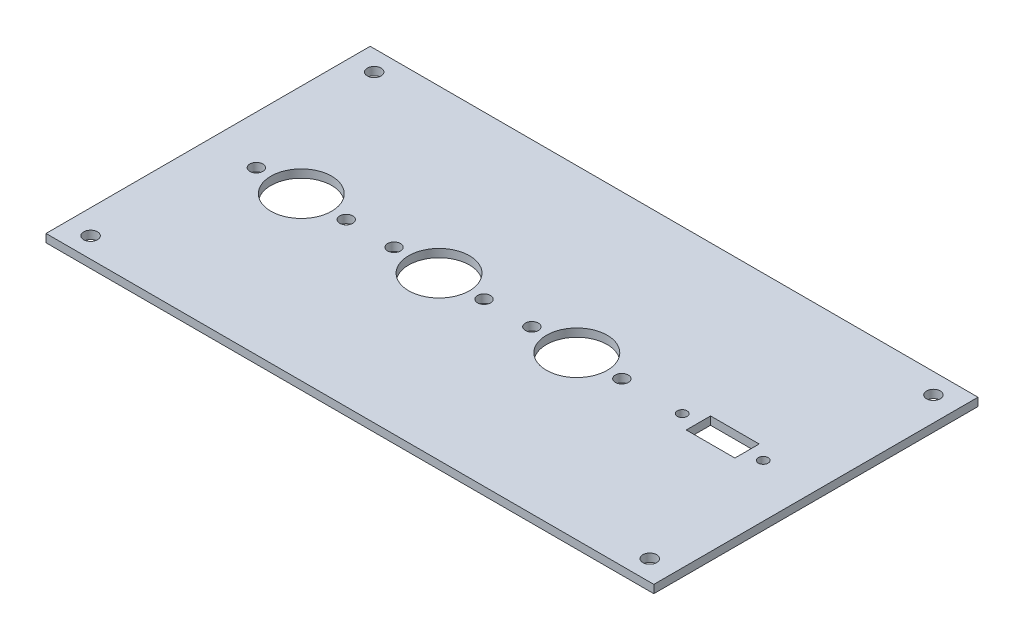
ISO-10303-21;
HEADER;
FILE_DESCRIPTION(('STEP AP214'),'2;1');
FILE_NAME('part.step','',(''),(''),'','','');
FILE_SCHEMA(('AUTOMOTIVE_DESIGN { 1 0 10303 214 1 1 1 1 }'));
ENDSEC;
DATA;
#1=APPLICATION_CONTEXT('core data for automotive mechanical design processes');
#2=APPLICATION_PROTOCOL_DEFINITION('international standard','automotive_design',2000,#1);
#3=PRODUCT_CONTEXT('',#1,'mechanical');
#4=PRODUCT('Part','Part','',(#3));
#5=PRODUCT_RELATED_PRODUCT_CATEGORY('part','',(#4));
#6=PRODUCT_DEFINITION_FORMATION('','',#4);
#7=PRODUCT_DEFINITION_CONTEXT('part definition',#1,'design');
#8=PRODUCT_DEFINITION('design','',#6,#7);
#9=PRODUCT_DEFINITION_SHAPE('','',#8);
#10=(LENGTH_UNIT() NAMED_UNIT(*) SI_UNIT(.MILLI.,.METRE.));
#11=(NAMED_UNIT(*) PLANE_ANGLE_UNIT() SI_UNIT($,.RADIAN.));
#12=(NAMED_UNIT(*) SI_UNIT($,.STERADIAN.) SOLID_ANGLE_UNIT());
#13=UNCERTAINTY_MEASURE_WITH_UNIT(LENGTH_MEASURE(1.E-05),#10,'distance_accuracy_value','');
#14=(GEOMETRIC_REPRESENTATION_CONTEXT(3) GLOBAL_UNCERTAINTY_ASSIGNED_CONTEXT((#13)) GLOBAL_UNIT_ASSIGNED_CONTEXT((#10,
#11,#12)) REPRESENTATION_CONTEXT('',''));
#15=CARTESIAN_POINT('',(0.,0.,0.));
#16=DIRECTION('',(0.,0.,1.));
#17=DIRECTION('',(1.,0.,0.));
#18=AXIS2_PLACEMENT_3D('',#15,#16,#17);
#19=CARTESIAN_POINT('',(0.,0.,80.));
#20=DIRECTION('',(0.,0.,1.));
#21=DIRECTION('',(1.,0.,0.));
#22=AXIS2_PLACEMENT_3D('',#19,#20,#21);
#23=PLANE('',#22);
#24=DIRECTION('',(-1.,0.,0.));
#25=VECTOR('',#24,1.);
#26=CARTESIAN_POINT('',(0.,-1.,80.));
#27=LINE('',#26,#25);
#28=CARTESIAN_POINT('',(75.,-1.,80.));
#29=VERTEX_POINT('',#28);
#30=CARTESIAN_POINT('',(-75.,-1.,80.));
#31=VERTEX_POINT('',#30);
#32=EDGE_CURVE('E87',#29,#31,#27,.T.);
#33=ORIENTED_EDGE('',*,*,#32,.F.);
#34=DIRECTION('',(0.,-1.,0.));
#35=VECTOR('',#34,1.);
#36=CARTESIAN_POINT('',(75.,0.,80.));
#37=LINE('',#36,#35);
#38=CARTESIAN_POINT('',(75.,1.,80.));
#39=VERTEX_POINT('',#38);
#40=EDGE_CURVE('E255',#39,#29,#37,.T.);
#41=ORIENTED_EDGE('',*,*,#40,.F.);
#42=DIRECTION('',(1.,0.,0.));
#43=VECTOR('',#42,1.);
#44=CARTESIAN_POINT('',(0.,1.,80.));
#45=LINE('',#44,#43);
#46=CARTESIAN_POINT('',(-75.,1.,80.));
#47=VERTEX_POINT('',#46);
#48=EDGE_CURVE('E259',#47,#39,#45,.T.);
#49=ORIENTED_EDGE('',*,*,#48,.F.);
#50=DIRECTION('',(0.,1.,0.));
#51=VECTOR('',#50,1.);
#52=CARTESIAN_POINT('',(-75.,0.,80.));
#53=LINE('',#52,#51);
#54=EDGE_CURVE('E262',#31,#47,#53,.T.);
#55=ORIENTED_EDGE('',*,*,#54,.F.);
#56=EDGE_LOOP('',(#33,#41,#49,#55));
#57=FACE_BOUND('',#56,.T.);
#58=ADVANCED_FACE('F17',(#57),#23,.T.);
#59=CARTESIAN_POINT('',(0.,-1.,0.));
#60=DIRECTION('',(0.,-1.,0.));
#61=DIRECTION('',(0.,0.,-1.));
#62=AXIS2_PLACEMENT_3D('',#59,#60,#61);
#63=PLANE('',#62);
#64=CARTESIAN_POINT('',(69.,-1.,75.));
#65=DIRECTION('',(0.,-1.,0.));
#66=DIRECTION('',(0.,0.,-1.));
#67=AXIS2_PLACEMENT_3D('',#64,#65,#66);
#68=CIRCLE('',#67,1.7);
#69=CARTESIAN_POINT('',(69.,-1.,73.3));
#70=VERTEX_POINT('',#69);
#71=EDGE_CURVE('E134',#70,#70,#68,.T.);
#72=ORIENTED_EDGE('',*,*,#71,.F.);
#73=EDGE_LOOP('',(#72));
#74=FACE_BOUND('',#73,.T.);
#75=CARTESIAN_POINT('',(69.,-1.,5.));
#76=DIRECTION('',(0.,-1.,0.));
#77=DIRECTION('',(0.,0.,-1.));
#78=AXIS2_PLACEMENT_3D('',#75,#76,#77);
#79=CIRCLE('',#78,1.7);
#80=CARTESIAN_POINT('',(69.,-1.,3.3));
#81=VERTEX_POINT('',#80);
#82=EDGE_CURVE('E130',#81,#81,#79,.T.);
#83=ORIENTED_EDGE('',*,*,#82,.F.);
#84=EDGE_LOOP('',(#83));
#85=FACE_BOUND('',#84,.T.);
#86=CARTESIAN_POINT('',(-69.,-1.,75.));
#87=DIRECTION('',(0.,-1.,0.));
#88=DIRECTION('',(0.,0.,-1.));
#89=AXIS2_PLACEMENT_3D('',#86,#87,#88);
#90=CIRCLE('',#89,1.7);
#91=CARTESIAN_POINT('',(-69.,-1.,73.3));
#92=VERTEX_POINT('',#91);
#93=EDGE_CURVE('E126',#92,#92,#90,.T.);
#94=ORIENTED_EDGE('',*,*,#93,.F.);
#95=EDGE_LOOP('',(#94));
#96=FACE_BOUND('',#95,.T.);
#97=CARTESIAN_POINT('',(-69.,-1.,5.));
#98=DIRECTION('',(0.,-1.,0.));
#99=DIRECTION('',(0.,0.,-1.));
#100=AXIS2_PLACEMENT_3D('',#97,#98,#99);
#101=CIRCLE('',#100,1.7);
#102=CARTESIAN_POINT('',(-69.,-1.,3.3));
#103=VERTEX_POINT('',#102);
#104=EDGE_CURVE('E121',#103,#103,#101,.T.);
#105=ORIENTED_EDGE('',*,*,#104,.F.);
#106=EDGE_LOOP('',(#105));
#107=FACE_BOUND('',#106,.T.);
#108=CARTESIAN_POINT('',(62.,-1.,40.));
#109=DIRECTION('',(0.,-1.,0.));
#110=DIRECTION('',(0.,0.,-1.));
#111=AXIS2_PLACEMENT_3D('',#108,#109,#110);
#112=CIRCLE('',#111,1.2);
#113=CARTESIAN_POINT('',(62.,-1.,38.8));
#114=VERTEX_POINT('',#113);
#115=EDGE_CURVE('E116',#114,#114,#112,.T.);
#116=ORIENTED_EDGE('',*,*,#115,.F.);
#117=EDGE_LOOP('',(#116));
#118=FACE_BOUND('',#117,.T.);
#119=CARTESIAN_POINT('',(42.,-1.,40.));
#120=DIRECTION('',(0.,-1.,0.));
#121=DIRECTION('',(0.,0.,-1.));
#122=AXIS2_PLACEMENT_3D('',#119,#120,#121);
#123=CIRCLE('',#122,1.2);
#124=CARTESIAN_POINT('',(42.,-1.,38.8));
#125=VERTEX_POINT('',#124);
#126=EDGE_CURVE('E115',#125,#125,#123,.T.);
#127=ORIENTED_EDGE('',*,*,#126,.F.);
#128=EDGE_LOOP('',(#127));
#129=FACE_BOUND('',#128,.T.);
#130=DIRECTION('',(-1.,0.,0.));
#131=VECTOR('',#130,1.);
#132=CARTESIAN_POINT('',(0.,-1.,43.));
#133=LINE('',#132,#131);
#134=CARTESIAN_POINT('',(58.,-1.,43.));
#135=VERTEX_POINT('',#134);
#136=CARTESIAN_POINT('',(46.,-1.,43.));
#137=VERTEX_POINT('',#136);
#138=EDGE_CURVE('E178',#135,#137,#133,.T.);
#139=ORIENTED_EDGE('',*,*,#138,.F.);
#140=DIRECTION('',(0.,0.,1.));
#141=VECTOR('',#140,1.);
#142=CARTESIAN_POINT('',(58.,-1.,0.));
#143=LINE('',#142,#141);
#144=CARTESIAN_POINT('',(58.,-1.,37.));
#145=VERTEX_POINT('',#144);
#146=EDGE_CURVE('E170',#145,#135,#143,.T.);
#147=ORIENTED_EDGE('',*,*,#146,.F.);
#148=DIRECTION('',(1.,0.,0.));
#149=VECTOR('',#148,1.);
#150=CARTESIAN_POINT('',(0.,-1.,37.));
#151=LINE('',#150,#149);
#152=CARTESIAN_POINT('',(46.,-1.,37.));
#153=VERTEX_POINT('',#152);
#154=EDGE_CURVE('E94',#153,#145,#151,.T.);
#155=ORIENTED_EDGE('',*,*,#154,.F.);
#156=DIRECTION('',(0.,0.,-1.));
#157=VECTOR('',#156,1.);
#158=CARTESIAN_POINT('',(46.,-1.,0.));
#159=LINE('',#158,#157);
#160=EDGE_CURVE('E175',#137,#153,#159,.T.);
#161=ORIENTED_EDGE('',*,*,#160,.F.);
#162=EDGE_LOOP('',(#139,#147,#155,#161));
#163=FACE_BOUND('',#162,.T.);
#164=CARTESIAN_POINT('',(27.1,-1.,40.));
#165=DIRECTION('',(0.,-1.,0.));
#166=DIRECTION('',(0.,0.,-1.));
#167=AXIS2_PLACEMENT_3D('',#164,#165,#166);
#168=CIRCLE('',#167,1.6);
#169=CARTESIAN_POINT('',(27.1,-1.,38.4));
#170=VERTEX_POINT('',#169);
#171=EDGE_CURVE('E182',#170,#170,#168,.T.);
#172=ORIENTED_EDGE('',*,*,#171,.F.);
#173=EDGE_LOOP('',(#172));
#174=FACE_BOUND('',#173,.T.);
#175=CARTESIAN_POINT('',(4.9,-1.,40.));
#176=DIRECTION('',(0.,-1.,0.));
#177=DIRECTION('',(0.,0.,-1.));
#178=AXIS2_PLACEMENT_3D('',#175,#176,#177);
#179=CIRCLE('',#178,1.6);
#180=CARTESIAN_POINT('',(4.9,-1.,38.4));
#181=VERTEX_POINT('',#180);
#182=EDGE_CURVE('E186',#181,#181,#179,.T.);
#183=ORIENTED_EDGE('',*,*,#182,.F.);
#184=EDGE_LOOP('',(#183));
#185=FACE_BOUND('',#184,.T.);
#186=CARTESIAN_POINT('',(16.,-1.,40.));
#187=DIRECTION('',(0.,-1.,0.));
#188=DIRECTION('',(0.,0.,-1.));
#189=AXIS2_PLACEMENT_3D('',#186,#187,#188);
#190=CIRCLE('',#189,7.5);
#191=CARTESIAN_POINT('',(16.,-1.,32.5));
#192=VERTEX_POINT('',#191);
#193=EDGE_CURVE('E191',#192,#192,#190,.T.);
#194=ORIENTED_EDGE('',*,*,#193,.F.);
#195=EDGE_LOOP('',(#194));
#196=FACE_BOUND('',#195,.T.);
#197=CARTESIAN_POINT('',(-6.9,-1.,40.));
#198=DIRECTION('',(0.,-1.,0.));
#199=DIRECTION('',(0.,0.,-1.));
#200=AXIS2_PLACEMENT_3D('',#197,#198,#199);
#201=CIRCLE('',#200,1.6);
#202=CARTESIAN_POINT('',(-6.9,-1.,38.4));
#203=VERTEX_POINT('',#202);
#204=EDGE_CURVE('E196',#203,#203,#201,.T.);
#205=ORIENTED_EDGE('',*,*,#204,.F.);
#206=EDGE_LOOP('',(#205));
#207=FACE_BOUND('',#206,.T.);
#208=CARTESIAN_POINT('',(-29.1,-1.,40.));
#209=DIRECTION('',(0.,-1.,0.));
#210=DIRECTION('',(0.,0.,-1.));
#211=AXIS2_PLACEMENT_3D('',#208,#209,#210);
#212=CIRCLE('',#211,1.6);
#213=CARTESIAN_POINT('',(-29.1,-1.,38.4));
#214=VERTEX_POINT('',#213);
#215=EDGE_CURVE('E201',#214,#214,#212,.T.);
#216=ORIENTED_EDGE('',*,*,#215,.F.);
#217=EDGE_LOOP('',(#216));
#218=FACE_BOUND('',#217,.T.);
#219=CARTESIAN_POINT('',(-18.,-1.,40.));
#220=DIRECTION('',(0.,-1.,0.));
#221=DIRECTION('',(0.,0.,-1.));
#222=AXIS2_PLACEMENT_3D('',#219,#220,#221);
#223=CIRCLE('',#222,7.5);
#224=CARTESIAN_POINT('',(-18.,-1.,32.5));
#225=VERTEX_POINT('',#224);
#226=EDGE_CURVE('E206',#225,#225,#223,.T.);
#227=ORIENTED_EDGE('',*,*,#226,.F.);
#228=EDGE_LOOP('',(#227));
#229=FACE_BOUND('',#228,.T.);
#230=CARTESIAN_POINT('',(-40.9,-1.,40.));
#231=DIRECTION('',(0.,-1.,0.));
#232=DIRECTION('',(0.,0.,-1.));
#233=AXIS2_PLACEMENT_3D('',#230,#231,#232);
#234=CIRCLE('',#233,1.6);
#235=CARTESIAN_POINT('',(-40.9,-1.,38.4));
#236=VERTEX_POINT('',#235);
#237=EDGE_CURVE('E211',#236,#236,#234,.T.);
#238=ORIENTED_EDGE('',*,*,#237,.F.);
#239=EDGE_LOOP('',(#238));
#240=FACE_BOUND('',#239,.T.);
#241=CARTESIAN_POINT('',(-63.1,-1.,40.));
#242=DIRECTION('',(0.,-1.,0.));
#243=DIRECTION('',(0.,0.,-1.));
#244=AXIS2_PLACEMENT_3D('',#241,#242,#243);
#245=CIRCLE('',#244,1.6);
#246=CARTESIAN_POINT('',(-63.1,-1.,38.4));
#247=VERTEX_POINT('',#246);
#248=EDGE_CURVE('E216',#247,#247,#245,.T.);
#249=ORIENTED_EDGE('',*,*,#248,.F.);
#250=EDGE_LOOP('',(#249));
#251=FACE_BOUND('',#250,.T.);
#252=CARTESIAN_POINT('',(-52.,-1.,40.));
#253=DIRECTION('',(0.,-1.,0.));
#254=DIRECTION('',(0.,0.,-1.));
#255=AXIS2_PLACEMENT_3D('',#252,#253,#254);
#256=CIRCLE('',#255,7.5);
#257=CARTESIAN_POINT('',(-52.,-1.,32.5));
#258=VERTEX_POINT('',#257);
#259=EDGE_CURVE('E221',#258,#258,#256,.T.);
#260=ORIENTED_EDGE('',*,*,#259,.F.);
#261=EDGE_LOOP('',(#260));
#262=FACE_BOUND('',#261,.T.);
#263=DIRECTION('',(0.,0.,1.));
#264=VECTOR('',#263,1.);
#265=CARTESIAN_POINT('',(75.,-1.,0.));
#266=LINE('',#265,#264);
#267=CARTESIAN_POINT('',(75.,-1.,0.));
#268=VERTEX_POINT('',#267);
#269=EDGE_CURVE('E234',#268,#29,#266,.T.);
#270=ORIENTED_EDGE('',*,*,#269,.T.);
#271=ORIENTED_EDGE('',*,*,#32,.T.);
#272=DIRECTION('',(0.,0.,1.));
#273=VECTOR('',#272,1.);
#274=CARTESIAN_POINT('',(-75.,-1.,0.));
#275=LINE('',#274,#273);
#276=CARTESIAN_POINT('',(-75.,-1.,0.));
#277=VERTEX_POINT('',#276);
#278=EDGE_CURVE('E251',#277,#31,#275,.T.);
#279=ORIENTED_EDGE('',*,*,#278,.F.);
#280=DIRECTION('',(1.,0.,0.));
#281=VECTOR('',#280,1.);
#282=CARTESIAN_POINT('',(0.,-1.,0.));
#283=LINE('',#282,#281);
#284=EDGE_CURVE('E225',#277,#268,#283,.T.);
#285=ORIENTED_EDGE('',*,*,#284,.T.);
#286=EDGE_LOOP('',(#270,#271,#279,#285));
#287=FACE_BOUND('',#286,.T.);
#288=ADVANCED_FACE('F329',(#74,#85,#96,#107,#118,#129,#163,#174,#185,#196,#207,#218,#229,#240,
#251,#262,#287),#63,.T.);
#289=CARTESIAN_POINT('',(-75.,0.,0.));
#290=DIRECTION('',(-1.,0.,0.));
#291=DIRECTION('',(0.,0.,1.));
#292=AXIS2_PLACEMENT_3D('',#289,#290,#291);
#293=PLANE('',#292);
#294=ORIENTED_EDGE('',*,*,#278,.T.);
#295=ORIENTED_EDGE('',*,*,#54,.T.);
#296=DIRECTION('',(0.,0.,1.));
#297=VECTOR('',#296,1.);
#298=CARTESIAN_POINT('',(-75.,1.,0.));
#299=LINE('',#298,#297);
#300=CARTESIAN_POINT('',(-75.,1.,0.));
#301=VERTEX_POINT('',#300);
#302=EDGE_CURVE('E247',#301,#47,#299,.T.);
#303=ORIENTED_EDGE('',*,*,#302,.F.);
#304=DIRECTION('',(0.,-1.,0.));
#305=VECTOR('',#304,1.);
#306=CARTESIAN_POINT('',(-75.,0.,0.));
#307=LINE('',#306,#305);
#308=EDGE_CURVE('E229',#301,#277,#307,.T.);
#309=ORIENTED_EDGE('',*,*,#308,.T.);
#310=EDGE_LOOP('',(#294,#295,#303,#309));
#311=FACE_BOUND('',#310,.T.);
#312=ADVANCED_FACE('F297',(#311),#293,.T.);
#313=CARTESIAN_POINT('',(0.,1.,0.));
#314=DIRECTION('',(0.,1.,0.));
#315=DIRECTION('',(0.,0.,1.));
#316=AXIS2_PLACEMENT_3D('',#313,#314,#315);
#317=PLANE('',#316);
#318=CARTESIAN_POINT('',(69.,1.,75.));
#319=DIRECTION('',(0.,1.,0.));
#320=DIRECTION('',(0.,0.,1.));
#321=AXIS2_PLACEMENT_3D('',#318,#319,#320);
#322=CIRCLE('',#321,1.7);
#323=CARTESIAN_POINT('',(69.,1.,76.7));
#324=VERTEX_POINT('',#323);
#325=EDGE_CURVE('E20',#324,#324,#322,.T.);
#326=ORIENTED_EDGE('',*,*,#325,.F.);
#327=EDGE_LOOP('',(#326));
#328=FACE_BOUND('',#327,.T.);
#329=CARTESIAN_POINT('',(69.,1.,5.));
#330=DIRECTION('',(0.,1.,0.));
#331=DIRECTION('',(0.,0.,1.));
#332=AXIS2_PLACEMENT_3D('',#329,#330,#331);
#333=CIRCLE('',#332,1.7);
#334=CARTESIAN_POINT('',(69.,1.,6.7));
#335=VERTEX_POINT('',#334);
#336=EDGE_CURVE('E131',#335,#335,#333,.T.);
#337=ORIENTED_EDGE('',*,*,#336,.F.);
#338=EDGE_LOOP('',(#337));
#339=FACE_BOUND('',#338,.T.);
#340=CARTESIAN_POINT('',(-69.,1.,75.));
#341=DIRECTION('',(0.,1.,0.));
#342=DIRECTION('',(0.,0.,1.));
#343=AXIS2_PLACEMENT_3D('',#340,#341,#342);
#344=CIRCLE('',#343,1.7);
#345=CARTESIAN_POINT('',(-69.,1.,76.7));
#346=VERTEX_POINT('',#345);
#347=EDGE_CURVE('E127',#346,#346,#344,.T.);
#348=ORIENTED_EDGE('',*,*,#347,.F.);
#349=EDGE_LOOP('',(#348));
#350=FACE_BOUND('',#349,.T.);
#351=CARTESIAN_POINT('',(-69.,1.,5.));
#352=DIRECTION('',(0.,1.,0.));
#353=DIRECTION('',(0.,0.,1.));
#354=AXIS2_PLACEMENT_3D('',#351,#352,#353);
#355=CIRCLE('',#354,1.7);
#356=CARTESIAN_POINT('',(-69.,1.,6.7));
#357=VERTEX_POINT('',#356);
#358=EDGE_CURVE('E122',#357,#357,#355,.T.);
#359=ORIENTED_EDGE('',*,*,#358,.F.);
#360=EDGE_LOOP('',(#359));
#361=FACE_BOUND('',#360,.T.);
#362=CARTESIAN_POINT('',(62.,1.,40.));
#363=DIRECTION('',(0.,1.,0.));
#364=DIRECTION('',(0.,0.,1.));
#365=AXIS2_PLACEMENT_3D('',#362,#363,#364);
#366=CIRCLE('',#365,1.2);
#367=CARTESIAN_POINT('',(62.,1.,41.2));
#368=VERTEX_POINT('',#367);
#369=EDGE_CURVE('E117',#368,#368,#366,.T.);
#370=ORIENTED_EDGE('',*,*,#369,.F.);
#371=EDGE_LOOP('',(#370));
#372=FACE_BOUND('',#371,.T.);
#373=CARTESIAN_POINT('',(42.,1.,40.));
#374=DIRECTION('',(0.,1.,0.));
#375=DIRECTION('',(0.,0.,1.));
#376=AXIS2_PLACEMENT_3D('',#373,#374,#375);
#377=CIRCLE('',#376,1.2);
#378=CARTESIAN_POINT('',(42.,1.,41.2));
#379=VERTEX_POINT('',#378);
#380=EDGE_CURVE('E111',#379,#379,#377,.T.);
#381=ORIENTED_EDGE('',*,*,#380,.F.);
#382=EDGE_LOOP('',(#381));
#383=FACE_BOUND('',#382,.T.);
#384=DIRECTION('',(1.,0.,0.));
#385=VECTOR('',#384,1.);
#386=CARTESIAN_POINT('',(0.,1.,43.));
#387=LINE('',#386,#385);
#388=CARTESIAN_POINT('',(46.,1.,43.));
#389=VERTEX_POINT('',#388);
#390=CARTESIAN_POINT('',(58.,1.,43.));
#391=VERTEX_POINT('',#390);
#392=EDGE_CURVE('E11',#389,#391,#387,.T.);
#393=ORIENTED_EDGE('',*,*,#392,.F.);
#394=DIRECTION('',(0.,0.,1.));
#395=VECTOR('',#394,1.);
#396=CARTESIAN_POINT('',(46.,1.,0.));
#397=LINE('',#396,#395);
#398=CARTESIAN_POINT('',(46.,1.,37.));
#399=VERTEX_POINT('',#398);
#400=EDGE_CURVE('E26',#399,#389,#397,.T.);
#401=ORIENTED_EDGE('',*,*,#400,.F.);
#402=DIRECTION('',(-1.,0.,0.));
#403=VECTOR('',#402,1.);
#404=CARTESIAN_POINT('',(0.,1.,37.));
#405=LINE('',#404,#403);
#406=CARTESIAN_POINT('',(58.,1.,37.));
#407=VERTEX_POINT('',#406);
#408=EDGE_CURVE('E86',#407,#399,#405,.T.);
#409=ORIENTED_EDGE('',*,*,#408,.F.);
#410=DIRECTION('',(0.,0.,-1.));
#411=VECTOR('',#410,1.);
#412=CARTESIAN_POINT('',(58.,1.,0.));
#413=LINE('',#412,#411);
#414=EDGE_CURVE('E80',#391,#407,#413,.T.);
#415=ORIENTED_EDGE('',*,*,#414,.F.);
#416=EDGE_LOOP('',(#393,#401,#409,#415));
#417=FACE_BOUND('',#416,.T.);
#418=CARTESIAN_POINT('',(27.1,1.,40.));
#419=DIRECTION('',(0.,1.,0.));
#420=DIRECTION('',(0.,0.,1.));
#421=AXIS2_PLACEMENT_3D('',#418,#419,#420);
#422=CIRCLE('',#421,1.6);
#423=CARTESIAN_POINT('',(27.1,1.,41.6));
#424=VERTEX_POINT('',#423);
#425=EDGE_CURVE('E181',#424,#424,#422,.T.);
#426=ORIENTED_EDGE('',*,*,#425,.F.);
#427=EDGE_LOOP('',(#426));
#428=FACE_BOUND('',#427,.T.);
#429=CARTESIAN_POINT('',(4.9,1.,40.));
#430=DIRECTION('',(0.,1.,0.));
#431=DIRECTION('',(0.,0.,1.));
#432=AXIS2_PLACEMENT_3D('',#429,#430,#431);
#433=CIRCLE('',#432,1.6);
#434=CARTESIAN_POINT('',(4.9,1.,41.6));
#435=VERTEX_POINT('',#434);
#436=EDGE_CURVE('E185',#435,#435,#433,.T.);
#437=ORIENTED_EDGE('',*,*,#436,.F.);
#438=EDGE_LOOP('',(#437));
#439=FACE_BOUND('',#438,.T.);
#440=CARTESIAN_POINT('',(16.,1.,40.));
#441=DIRECTION('',(0.,1.,0.));
#442=DIRECTION('',(0.,0.,1.));
#443=AXIS2_PLACEMENT_3D('',#440,#441,#442);
#444=CIRCLE('',#443,7.5);
#445=CARTESIAN_POINT('',(16.,1.,47.5));
#446=VERTEX_POINT('',#445);
#447=EDGE_CURVE('E190',#446,#446,#444,.T.);
#448=ORIENTED_EDGE('',*,*,#447,.F.);
#449=EDGE_LOOP('',(#448));
#450=FACE_BOUND('',#449,.T.);
#451=CARTESIAN_POINT('',(-6.9,1.,40.));
#452=DIRECTION('',(0.,1.,0.));
#453=DIRECTION('',(0.,0.,1.));
#454=AXIS2_PLACEMENT_3D('',#451,#452,#453);
#455=CIRCLE('',#454,1.6);
#456=CARTESIAN_POINT('',(-6.9,1.,41.6));
#457=VERTEX_POINT('',#456);
#458=EDGE_CURVE('E195',#457,#457,#455,.T.);
#459=ORIENTED_EDGE('',*,*,#458,.F.);
#460=EDGE_LOOP('',(#459));
#461=FACE_BOUND('',#460,.T.);
#462=CARTESIAN_POINT('',(-29.1,1.,40.));
#463=DIRECTION('',(0.,1.,0.));
#464=DIRECTION('',(0.,0.,1.));
#465=AXIS2_PLACEMENT_3D('',#462,#463,#464);
#466=CIRCLE('',#465,1.6);
#467=CARTESIAN_POINT('',(-29.1,1.,41.6));
#468=VERTEX_POINT('',#467);
#469=EDGE_CURVE('E200',#468,#468,#466,.T.);
#470=ORIENTED_EDGE('',*,*,#469,.F.);
#471=EDGE_LOOP('',(#470));
#472=FACE_BOUND('',#471,.T.);
#473=CARTESIAN_POINT('',(-18.,1.,40.));
#474=DIRECTION('',(0.,1.,0.));
#475=DIRECTION('',(0.,0.,1.));
#476=AXIS2_PLACEMENT_3D('',#473,#474,#475);
#477=CIRCLE('',#476,7.5);
#478=CARTESIAN_POINT('',(-18.,1.,47.5));
#479=VERTEX_POINT('',#478);
#480=EDGE_CURVE('E205',#479,#479,#477,.T.);
#481=ORIENTED_EDGE('',*,*,#480,.F.);
#482=EDGE_LOOP('',(#481));
#483=FACE_BOUND('',#482,.T.);
#484=CARTESIAN_POINT('',(-40.9,1.,40.));
#485=DIRECTION('',(0.,1.,0.));
#486=DIRECTION('',(0.,0.,1.));
#487=AXIS2_PLACEMENT_3D('',#484,#485,#486);
#488=CIRCLE('',#487,1.6);
#489=CARTESIAN_POINT('',(-40.9,1.,41.6));
#490=VERTEX_POINT('',#489);
#491=EDGE_CURVE('E210',#490,#490,#488,.T.);
#492=ORIENTED_EDGE('',*,*,#491,.F.);
#493=EDGE_LOOP('',(#492));
#494=FACE_BOUND('',#493,.T.);
#495=CARTESIAN_POINT('',(-63.1,1.,40.));
#496=DIRECTION('',(0.,1.,0.));
#497=DIRECTION('',(0.,0.,1.));
#498=AXIS2_PLACEMENT_3D('',#495,#496,#497);
#499=CIRCLE('',#498,1.6);
#500=CARTESIAN_POINT('',(-63.1,1.,41.6));
#501=VERTEX_POINT('',#500);
#502=EDGE_CURVE('E215',#501,#501,#499,.T.);
#503=ORIENTED_EDGE('',*,*,#502,.F.);
#504=EDGE_LOOP('',(#503));
#505=FACE_BOUND('',#504,.T.);
#506=CARTESIAN_POINT('',(-52.,1.,40.));
#507=DIRECTION('',(0.,1.,0.));
#508=DIRECTION('',(0.,0.,1.));
#509=AXIS2_PLACEMENT_3D('',#506,#507,#508);
#510=CIRCLE('',#509,7.5);
#511=CARTESIAN_POINT('',(-52.,1.,47.5));
#512=VERTEX_POINT('',#511);
#513=EDGE_CURVE('E220',#512,#512,#510,.T.);
#514=ORIENTED_EDGE('',*,*,#513,.F.);
#515=EDGE_LOOP('',(#514));
#516=FACE_BOUND('',#515,.T.);
#517=ORIENTED_EDGE('',*,*,#302,.T.);
#518=ORIENTED_EDGE('',*,*,#48,.T.);
#519=DIRECTION('',(0.,0.,1.));
#520=VECTOR('',#519,1.);
#521=CARTESIAN_POINT('',(75.,1.,0.));
#522=LINE('',#521,#520);
#523=CARTESIAN_POINT('',(75.,1.,0.));
#524=VERTEX_POINT('',#523);
#525=EDGE_CURVE('E244',#524,#39,#522,.T.);
#526=ORIENTED_EDGE('',*,*,#525,.F.);
#527=DIRECTION('',(-1.,0.,0.));
#528=VECTOR('',#527,1.);
#529=CARTESIAN_POINT('',(0.,1.,0.));
#530=LINE('',#529,#528);
#531=EDGE_CURVE('E235',#524,#301,#530,.T.);
#532=ORIENTED_EDGE('',*,*,#531,.T.);
#533=EDGE_LOOP('',(#517,#518,#526,#532));
#534=FACE_BOUND('',#533,.T.);
#535=ADVANCED_FACE('F100',(#328,#339,#350,#361,#372,#383,#417,#428,#439,#450,#461,#472,#483,
#494,#505,#516,#534),#317,.T.);
#536=CARTESIAN_POINT('',(0.,0.,0.));
#537=DIRECTION('',(0.,0.,-1.));
#538=DIRECTION('',(-1.,0.,0.));
#539=AXIS2_PLACEMENT_3D('',#536,#537,#538);
#540=PLANE('',#539);
#541=DIRECTION('',(0.,1.,0.));
#542=VECTOR('',#541,1.);
#543=CARTESIAN_POINT('',(75.,0.,0.));
#544=LINE('',#543,#542);
#545=EDGE_CURVE('E230',#268,#524,#544,.T.);
#546=ORIENTED_EDGE('',*,*,#545,.F.);
#547=ORIENTED_EDGE('',*,*,#284,.F.);
#548=ORIENTED_EDGE('',*,*,#308,.F.);
#549=ORIENTED_EDGE('',*,*,#531,.F.);
#550=EDGE_LOOP('',(#546,#547,#548,#549));
#551=FACE_BOUND('',#550,.T.);
#552=ADVANCED_FACE('F296',(#551),#540,.T.);
#553=CARTESIAN_POINT('',(75.,0.,0.));
#554=DIRECTION('',(1.,0.,0.));
#555=DIRECTION('',(0.,0.,-1.));
#556=AXIS2_PLACEMENT_3D('',#553,#554,#555);
#557=PLANE('',#556);
#558=ORIENTED_EDGE('',*,*,#545,.T.);
#559=ORIENTED_EDGE('',*,*,#525,.T.);
#560=ORIENTED_EDGE('',*,*,#40,.T.);
#561=ORIENTED_EDGE('',*,*,#269,.F.);
#562=EDGE_LOOP('',(#558,#559,#560,#561));
#563=FACE_BOUND('',#562,.T.);
#564=ADVANCED_FACE('F325',(#563),#557,.T.);
#565=CARTESIAN_POINT('',(-52.,-1.3,40.));
#566=DIRECTION('',(0.,1.,0.));
#567=DIRECTION('',(0.,0.,1.));
#568=AXIS2_PLACEMENT_3D('',#565,#566,#567);
#569=CYLINDRICAL_SURFACE('',#568,7.5);
#570=ORIENTED_EDGE('',*,*,#259,.T.);
#571=EDGE_LOOP('',(#570));
#572=FACE_BOUND('',#571,.T.);
#573=ORIENTED_EDGE('',*,*,#513,.T.);
#574=EDGE_LOOP('',(#573));
#575=FACE_BOUND('',#574,.T.);
#576=ADVANCED_FACE('F341',(#572,#575),#569,.F.);
#577=CARTESIAN_POINT('',(-63.1,-1.3,40.));
#578=DIRECTION('',(0.,1.,0.));
#579=DIRECTION('',(0.,0.,1.));
#580=AXIS2_PLACEMENT_3D('',#577,#578,#579);
#581=CYLINDRICAL_SURFACE('',#580,1.6);
#582=ORIENTED_EDGE('',*,*,#248,.T.);
#583=EDGE_LOOP('',(#582));
#584=FACE_BOUND('',#583,.T.);
#585=ORIENTED_EDGE('',*,*,#502,.T.);
#586=EDGE_LOOP('',(#585));
#587=FACE_BOUND('',#586,.T.);
#588=ADVANCED_FACE('F346',(#584,#587),#581,.F.);
#589=CARTESIAN_POINT('',(-40.9,-1.3,40.));
#590=DIRECTION('',(0.,1.,0.));
#591=DIRECTION('',(0.,0.,1.));
#592=AXIS2_PLACEMENT_3D('',#589,#590,#591);
#593=CYLINDRICAL_SURFACE('',#592,1.6);
#594=ORIENTED_EDGE('',*,*,#237,.T.);
#595=EDGE_LOOP('',(#594));
#596=FACE_BOUND('',#595,.T.);
#597=ORIENTED_EDGE('',*,*,#491,.T.);
#598=EDGE_LOOP('',(#597));
#599=FACE_BOUND('',#598,.T.);
#600=ADVANCED_FACE('F350',(#596,#599),#593,.F.);
#601=CARTESIAN_POINT('',(-18.,-1.3,40.));
#602=DIRECTION('',(0.,1.,0.));
#603=DIRECTION('',(0.,0.,1.));
#604=AXIS2_PLACEMENT_3D('',#601,#602,#603);
#605=CYLINDRICAL_SURFACE('',#604,7.5);
#606=ORIENTED_EDGE('',*,*,#226,.T.);
#607=EDGE_LOOP('',(#606));
#608=FACE_BOUND('',#607,.T.);
#609=ORIENTED_EDGE('',*,*,#480,.T.);
#610=EDGE_LOOP('',(#609));
#611=FACE_BOUND('',#610,.T.);
#612=ADVANCED_FACE('F354',(#608,#611),#605,.F.);
#613=CARTESIAN_POINT('',(-29.1,-1.3,40.));
#614=DIRECTION('',(0.,1.,0.));
#615=DIRECTION('',(0.,0.,1.));
#616=AXIS2_PLACEMENT_3D('',#613,#614,#615);
#617=CYLINDRICAL_SURFACE('',#616,1.6);
#618=ORIENTED_EDGE('',*,*,#215,.T.);
#619=EDGE_LOOP('',(#618));
#620=FACE_BOUND('',#619,.T.);
#621=ORIENTED_EDGE('',*,*,#469,.T.);
#622=EDGE_LOOP('',(#621));
#623=FACE_BOUND('',#622,.T.);
#624=ADVANCED_FACE('F358',(#620,#623),#617,.F.);
#625=CARTESIAN_POINT('',(-6.9,-1.3,40.));
#626=DIRECTION('',(0.,1.,0.));
#627=DIRECTION('',(0.,0.,1.));
#628=AXIS2_PLACEMENT_3D('',#625,#626,#627);
#629=CYLINDRICAL_SURFACE('',#628,1.6);
#630=ORIENTED_EDGE('',*,*,#204,.T.);
#631=EDGE_LOOP('',(#630));
#632=FACE_BOUND('',#631,.T.);
#633=ORIENTED_EDGE('',*,*,#458,.T.);
#634=EDGE_LOOP('',(#633));
#635=FACE_BOUND('',#634,.T.);
#636=ADVANCED_FACE('F362',(#632,#635),#629,.F.);
#637=CARTESIAN_POINT('',(16.,-1.3,40.));
#638=DIRECTION('',(0.,1.,0.));
#639=DIRECTION('',(0.,0.,1.));
#640=AXIS2_PLACEMENT_3D('',#637,#638,#639);
#641=CYLINDRICAL_SURFACE('',#640,7.5);
#642=ORIENTED_EDGE('',*,*,#193,.T.);
#643=EDGE_LOOP('',(#642));
#644=FACE_BOUND('',#643,.T.);
#645=ORIENTED_EDGE('',*,*,#447,.T.);
#646=EDGE_LOOP('',(#645));
#647=FACE_BOUND('',#646,.T.);
#648=ADVANCED_FACE('F366',(#644,#647),#641,.F.);
#649=CARTESIAN_POINT('',(4.9,-1.3,40.));
#650=DIRECTION('',(0.,1.,0.));
#651=DIRECTION('',(0.,0.,1.));
#652=AXIS2_PLACEMENT_3D('',#649,#650,#651);
#653=CYLINDRICAL_SURFACE('',#652,1.6);
#654=ORIENTED_EDGE('',*,*,#182,.T.);
#655=EDGE_LOOP('',(#654));
#656=FACE_BOUND('',#655,.T.);
#657=ORIENTED_EDGE('',*,*,#436,.T.);
#658=EDGE_LOOP('',(#657));
#659=FACE_BOUND('',#658,.T.);
#660=ADVANCED_FACE('F370',(#656,#659),#653,.F.);
#661=CARTESIAN_POINT('',(27.1,-1.3,40.));
#662=DIRECTION('',(0.,1.,0.));
#663=DIRECTION('',(0.,0.,1.));
#664=AXIS2_PLACEMENT_3D('',#661,#662,#663);
#665=CYLINDRICAL_SURFACE('',#664,1.6);
#666=ORIENTED_EDGE('',*,*,#171,.T.);
#667=EDGE_LOOP('',(#666));
#668=FACE_BOUND('',#667,.T.);
#669=ORIENTED_EDGE('',*,*,#425,.T.);
#670=EDGE_LOOP('',(#669));
#671=FACE_BOUND('',#670,.T.);
#672=ADVANCED_FACE('F293',(#668,#671),#665,.F.);
#673=CARTESIAN_POINT('',(52.,0.,43.));
#674=DIRECTION('',(0.,0.,1.));
#675=DIRECTION('',(1.,0.,0.));
#676=AXIS2_PLACEMENT_3D('',#673,#674,#675);
#677=PLANE('',#676);
#678=ORIENTED_EDGE('',*,*,#138,.T.);
#679=DIRECTION('',(0.,1.,0.));
#680=VECTOR('',#679,1.);
#681=CARTESIAN_POINT('',(46.,0.,43.));
#682=LINE('',#681,#680);
#683=EDGE_CURVE('E166',#137,#389,#682,.T.);
#684=ORIENTED_EDGE('',*,*,#683,.T.);
#685=ORIENTED_EDGE('',*,*,#392,.T.);
#686=DIRECTION('',(0.,-1.,0.));
#687=VECTOR('',#686,1.);
#688=CARTESIAN_POINT('',(58.,0.,43.));
#689=LINE('',#688,#687);
#690=EDGE_CURVE('E39',#391,#135,#689,.T.);
#691=ORIENTED_EDGE('',*,*,#690,.T.);
#692=EDGE_LOOP('',(#678,#684,#685,#691));
#693=FACE_BOUND('',#692,.T.);
#694=ADVANCED_FACE('F377',(#693),#677,.F.);
#695=CARTESIAN_POINT('',(46.,0.,37.));
#696=DIRECTION('',(-1.,0.,0.));
#697=DIRECTION('',(0.,0.,1.));
#698=AXIS2_PLACEMENT_3D('',#695,#696,#697);
#699=PLANE('',#698);
#700=ORIENTED_EDGE('',*,*,#160,.T.);
#701=DIRECTION('',(0.,-1.,0.));
#702=VECTOR('',#701,1.);
#703=CARTESIAN_POINT('',(46.,0.,37.));
#704=LINE('',#703,#702);
#705=EDGE_CURVE('E97',#399,#153,#704,.T.);
#706=ORIENTED_EDGE('',*,*,#705,.F.);
#707=ORIENTED_EDGE('',*,*,#400,.T.);
#708=ORIENTED_EDGE('',*,*,#683,.F.);
#709=EDGE_LOOP('',(#700,#706,#707,#708));
#710=FACE_BOUND('',#709,.T.);
#711=ADVANCED_FACE('F381',(#710),#699,.F.);
#712=CARTESIAN_POINT('',(52.,0.,37.));
#713=DIRECTION('',(0.,0.,-1.));
#714=DIRECTION('',(-1.,0.,0.));
#715=AXIS2_PLACEMENT_3D('',#712,#713,#714);
#716=PLANE('',#715);
#717=ORIENTED_EDGE('',*,*,#154,.T.);
#718=DIRECTION('',(0.,1.,0.));
#719=VECTOR('',#718,1.);
#720=CARTESIAN_POINT('',(58.,0.,37.));
#721=LINE('',#720,#719);
#722=EDGE_CURVE('E34',#145,#407,#721,.T.);
#723=ORIENTED_EDGE('',*,*,#722,.T.);
#724=ORIENTED_EDGE('',*,*,#408,.T.);
#725=ORIENTED_EDGE('',*,*,#705,.T.);
#726=EDGE_LOOP('',(#717,#723,#724,#725));
#727=FACE_BOUND('',#726,.T.);
#728=ADVANCED_FACE('F90',(#727),#716,.F.);
#729=CARTESIAN_POINT('',(58.,0.,37.));
#730=DIRECTION('',(1.,0.,0.));
#731=DIRECTION('',(0.,0.,-1.));
#732=AXIS2_PLACEMENT_3D('',#729,#730,#731);
#733=PLANE('',#732);
#734=ORIENTED_EDGE('',*,*,#146,.T.);
#735=ORIENTED_EDGE('',*,*,#690,.F.);
#736=ORIENTED_EDGE('',*,*,#414,.T.);
#737=ORIENTED_EDGE('',*,*,#722,.F.);
#738=EDGE_LOOP('',(#734,#735,#736,#737));
#739=FACE_BOUND('',#738,.T.);
#740=ADVANCED_FACE('F81',(#739),#733,.F.);
#741=CARTESIAN_POINT('',(42.,-1.3,40.));
#742=DIRECTION('',(0.,1.,0.));
#743=DIRECTION('',(0.,0.,1.));
#744=AXIS2_PLACEMENT_3D('',#741,#742,#743);
#745=CYLINDRICAL_SURFACE('',#744,1.2);
#746=ORIENTED_EDGE('',*,*,#126,.T.);
#747=EDGE_LOOP('',(#746));
#748=FACE_BOUND('',#747,.T.);
#749=ORIENTED_EDGE('',*,*,#380,.T.);
#750=EDGE_LOOP('',(#749));
#751=FACE_BOUND('',#750,.T.);
#752=ADVANCED_FACE('F388',(#748,#751),#745,.F.);
#753=CARTESIAN_POINT('',(62.,-1.3,40.));
#754=DIRECTION('',(0.,1.,0.));
#755=DIRECTION('',(0.,0.,1.));
#756=AXIS2_PLACEMENT_3D('',#753,#754,#755);
#757=CYLINDRICAL_SURFACE('',#756,1.2);
#758=ORIENTED_EDGE('',*,*,#115,.T.);
#759=EDGE_LOOP('',(#758));
#760=FACE_BOUND('',#759,.T.);
#761=ORIENTED_EDGE('',*,*,#369,.T.);
#762=EDGE_LOOP('',(#761));
#763=FACE_BOUND('',#762,.T.);
#764=ADVANCED_FACE('F393',(#760,#763),#757,.F.);
#765=CARTESIAN_POINT('',(-69.,-1.3,5.));
#766=DIRECTION('',(0.,1.,0.));
#767=DIRECTION('',(0.,0.,1.));
#768=AXIS2_PLACEMENT_3D('',#765,#766,#767);
#769=CYLINDRICAL_SURFACE('',#768,1.7);
#770=ORIENTED_EDGE('',*,*,#104,.T.);
#771=EDGE_LOOP('',(#770));
#772=FACE_BOUND('',#771,.T.);
#773=ORIENTED_EDGE('',*,*,#358,.T.);
#774=EDGE_LOOP('',(#773));
#775=FACE_BOUND('',#774,.T.);
#776=ADVANCED_FACE('F397',(#772,#775),#769,.F.);
#777=CARTESIAN_POINT('',(-69.,-1.3,75.));
#778=DIRECTION('',(0.,1.,0.));
#779=DIRECTION('',(0.,0.,1.));
#780=AXIS2_PLACEMENT_3D('',#777,#778,#779);
#781=CYLINDRICAL_SURFACE('',#780,1.7);
#782=ORIENTED_EDGE('',*,*,#93,.T.);
#783=EDGE_LOOP('',(#782));
#784=FACE_BOUND('',#783,.T.);
#785=ORIENTED_EDGE('',*,*,#347,.T.);
#786=EDGE_LOOP('',(#785));
#787=FACE_BOUND('',#786,.T.);
#788=ADVANCED_FACE('F401',(#784,#787),#781,.F.);
#789=CARTESIAN_POINT('',(69.,-1.3,5.));
#790=DIRECTION('',(0.,1.,0.));
#791=DIRECTION('',(0.,0.,1.));
#792=AXIS2_PLACEMENT_3D('',#789,#790,#791);
#793=CYLINDRICAL_SURFACE('',#792,1.7);
#794=ORIENTED_EDGE('',*,*,#82,.T.);
#795=EDGE_LOOP('',(#794));
#796=FACE_BOUND('',#795,.T.);
#797=ORIENTED_EDGE('',*,*,#336,.T.);
#798=EDGE_LOOP('',(#797));
#799=FACE_BOUND('',#798,.T.);
#800=ADVANCED_FACE('F405',(#796,#799),#793,.F.);
#801=CARTESIAN_POINT('',(69.,-1.3,75.));
#802=DIRECTION('',(0.,1.,0.));
#803=DIRECTION('',(0.,0.,1.));
#804=AXIS2_PLACEMENT_3D('',#801,#802,#803);
#805=CYLINDRICAL_SURFACE('',#804,1.7);
#806=ORIENTED_EDGE('',*,*,#71,.T.);
#807=EDGE_LOOP('',(#806));
#808=FACE_BOUND('',#807,.T.);
#809=ORIENTED_EDGE('',*,*,#325,.T.);
#810=EDGE_LOOP('',(#809));
#811=FACE_BOUND('',#810,.T.);
#812=ADVANCED_FACE('F409',(#808,#811),#805,.F.);
#813=CLOSED_SHELL('',(#58,#288,#312,#535,#552,#564,#576,#588,#600,#612,#624,#636,#648,#660,#672,
#694,#711,#728,#740,#752,#764,#776,#788,#800,#812));
#814=MANIFOLD_SOLID_BREP('B1',#813);
#815=ADVANCED_BREP_SHAPE_REPRESENTATION('',(#18,#814),#14);
#816=SHAPE_DEFINITION_REPRESENTATION(#9,#815);
ENDSEC;
END-ISO-10303-21;
